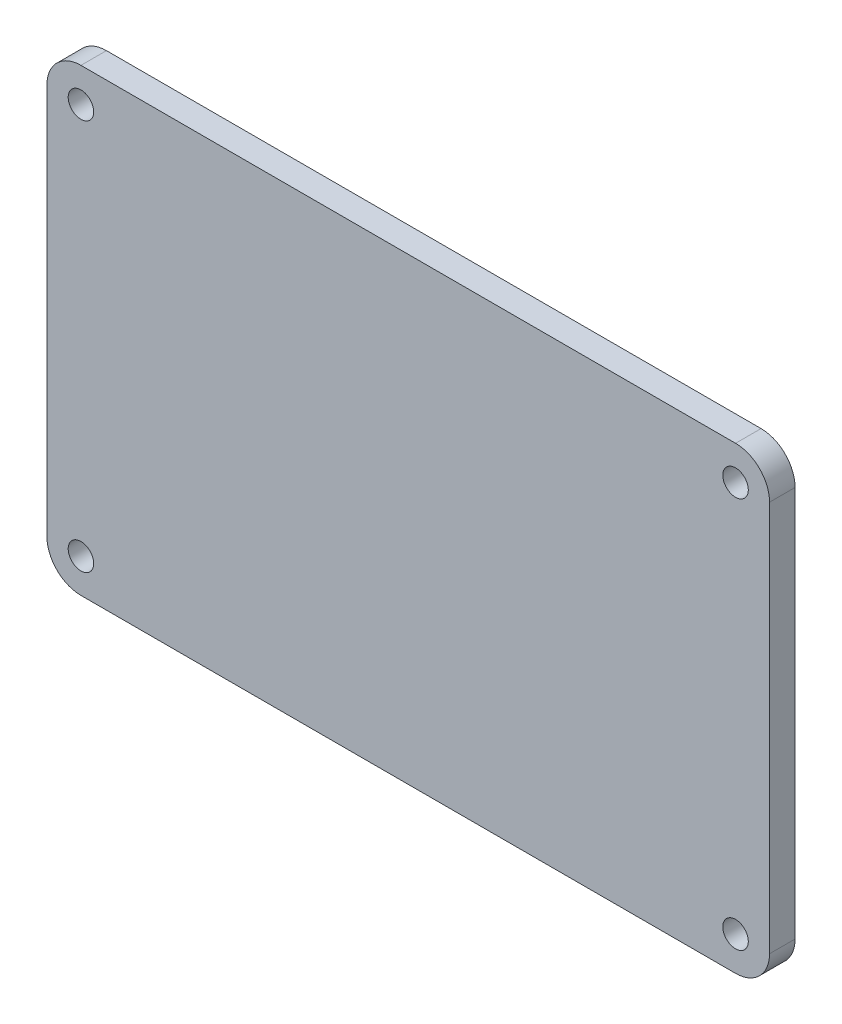
ISO-10303-21;
HEADER;
FILE_DESCRIPTION(('STEP AP214'),'2;1');
FILE_NAME('part.step','',(''),(''),'','','');
FILE_SCHEMA(('AUTOMOTIVE_DESIGN { 1 0 10303 214 1 1 1 1 }'));
ENDSEC;
DATA;
#1=APPLICATION_CONTEXT('core data for automotive mechanical design processes');
#2=APPLICATION_PROTOCOL_DEFINITION('international standard','automotive_design',2000,#1);
#3=PRODUCT_CONTEXT('',#1,'mechanical');
#4=PRODUCT('Part','Part','',(#3));
#5=PRODUCT_RELATED_PRODUCT_CATEGORY('part','',(#4));
#6=PRODUCT_DEFINITION_FORMATION('','',#4);
#7=PRODUCT_DEFINITION_CONTEXT('part definition',#1,'design');
#8=PRODUCT_DEFINITION('design','',#6,#7);
#9=PRODUCT_DEFINITION_SHAPE('','',#8);
#10=(LENGTH_UNIT() NAMED_UNIT(*) SI_UNIT(.MILLI.,.METRE.));
#11=(NAMED_UNIT(*) PLANE_ANGLE_UNIT() SI_UNIT($,.RADIAN.));
#12=(NAMED_UNIT(*) SI_UNIT($,.STERADIAN.) SOLID_ANGLE_UNIT());
#13=UNCERTAINTY_MEASURE_WITH_UNIT(LENGTH_MEASURE(1.E-05),#10,'distance_accuracy_value','');
#14=(GEOMETRIC_REPRESENTATION_CONTEXT(3) GLOBAL_UNCERTAINTY_ASSIGNED_CONTEXT((#13)) GLOBAL_UNIT_ASSIGNED_CONTEXT((#10,
#11,#12)) REPRESENTATION_CONTEXT('',''));
#15=CARTESIAN_POINT('',(0.,0.,0.));
#16=DIRECTION('',(0.,0.,1.));
#17=DIRECTION('',(1.,0.,0.));
#18=AXIS2_PLACEMENT_3D('',#15,#16,#17);
#19=CARTESIAN_POINT('',(106.789511844505,744.246017928353,-1986.57892124307));
#20=DIRECTION('',(0.,0.,1.));
#21=DIRECTION('',(1.,0.,0.));
#22=AXIS2_PLACEMENT_3D('',#19,#20,#21);
#23=PLANE('',#22);
#24=CARTESIAN_POINT('',(183.789511844505,744.246017928353,-1986.57892124307));
#25=DIRECTION('',(0.,0.,1.));
#26=DIRECTION('',(1.,0.,0.));
#27=AXIS2_PLACEMENT_3D('',#24,#25,#26);
#28=CIRCLE('',#27,1.5);
#29=CARTESIAN_POINT('',(185.289511844505,744.246017928353,-1986.57892124307));
#30=VERTEX_POINT('',#29);
#31=EDGE_CURVE('E221',#30,#30,#28,.T.);
#32=ORIENTED_EDGE('',*,*,#31,.F.);
#33=EDGE_LOOP('',(#32));
#34=FACE_BOUND('',#33,.T.);
#35=CARTESIAN_POINT('',(106.789511844505,698.246017928353,-1986.57892124307));
#36=DIRECTION('',(0.,0.,1.));
#37=DIRECTION('',(1.,0.,0.));
#38=AXIS2_PLACEMENT_3D('',#35,#36,#37);
#39=CIRCLE('',#38,1.49999999999994);
#40=CARTESIAN_POINT('',(108.289511844505,698.246017928353,-1986.57892124307));
#41=VERTEX_POINT('',#40);
#42=EDGE_CURVE('E146',#41,#41,#39,.T.);
#43=ORIENTED_EDGE('',*,*,#42,.F.);
#44=EDGE_LOOP('',(#43));
#45=FACE_BOUND('',#44,.T.);
#46=CARTESIAN_POINT('',(106.789511844505,744.246017928353,-1986.57892124307));
#47=DIRECTION('',(0.,0.,1.));
#48=DIRECTION('',(1.,0.,0.));
#49=AXIS2_PLACEMENT_3D('',#46,#47,#48);
#50=CIRCLE('',#49,4.00000000000002);
#51=CARTESIAN_POINT('',(106.789511844505,748.246017928353,-1986.57892124307));
#52=VERTEX_POINT('',#51);
#53=CARTESIAN_POINT('',(102.789511844505,744.246017928353,-1986.57892124307));
#54=VERTEX_POINT('',#53);
#55=EDGE_CURVE('E164',#52,#54,#50,.T.);
#56=ORIENTED_EDGE('',*,*,#55,.T.);
#57=DIRECTION('',(0.,-1.,0.));
#58=VECTOR('',#57,1.);
#59=CARTESIAN_POINT('',(102.789511844505,744.246017928353,-1986.57892124307));
#60=LINE('',#59,#58);
#61=CARTESIAN_POINT('',(102.789511844505,698.246017928353,-1986.57892124307));
#62=VERTEX_POINT('',#61);
#63=EDGE_CURVE('E100',#54,#62,#60,.T.);
#64=ORIENTED_EDGE('',*,*,#63,.T.);
#65=CARTESIAN_POINT('',(106.789511844505,698.246017928353,-1986.57892124307));
#66=DIRECTION('',(0.,0.,1.));
#67=DIRECTION('',(1.,0.,0.));
#68=AXIS2_PLACEMENT_3D('',#65,#66,#67);
#69=CIRCLE('',#68,4.);
#70=CARTESIAN_POINT('',(106.789511844505,694.246017928353,-1986.57892124307));
#71=VERTEX_POINT('',#70);
#72=EDGE_CURVE('E185',#62,#71,#69,.T.);
#73=ORIENTED_EDGE('',*,*,#72,.T.);
#74=DIRECTION('',(1.,0.,0.));
#75=VECTOR('',#74,1.);
#76=CARTESIAN_POINT('',(183.789511844505,694.246017928353,-1986.57892124307));
#77=LINE('',#76,#75);
#78=CARTESIAN_POINT('',(183.789511844505,694.246017928353,-1986.57892124307));
#79=VERTEX_POINT('',#78);
#80=EDGE_CURVE('E199',#71,#79,#77,.T.);
#81=ORIENTED_EDGE('',*,*,#80,.T.);
#82=CARTESIAN_POINT('',(183.789511844505,698.246017928353,-1986.57892124307));
#83=DIRECTION('',(0.,0.,1.));
#84=DIRECTION('',(1.,0.,0.));
#85=AXIS2_PLACEMENT_3D('',#82,#83,#84);
#86=CIRCLE('',#85,3.99999999999999);
#87=CARTESIAN_POINT('',(187.789511844505,698.246017928353,-1986.57892124307));
#88=VERTEX_POINT('',#87);
#89=EDGE_CURVE('E119',#79,#88,#86,.T.);
#90=ORIENTED_EDGE('',*,*,#89,.T.);
#91=DIRECTION('',(0.,1.,0.));
#92=VECTOR('',#91,1.);
#93=CARTESIAN_POINT('',(187.789511844505,744.246017928353,-1986.57892124307));
#94=LINE('',#93,#92);
#95=CARTESIAN_POINT('',(187.789511844505,744.246017928353,-1986.57892124307));
#96=VERTEX_POINT('',#95);
#97=EDGE_CURVE('E113',#88,#96,#94,.T.);
#98=ORIENTED_EDGE('',*,*,#97,.T.);
#99=CARTESIAN_POINT('',(183.789511844505,744.246017928353,-1986.57892124307));
#100=DIRECTION('',(0.,0.,1.));
#101=DIRECTION('',(-1.,0.,0.));
#102=AXIS2_PLACEMENT_3D('',#99,#100,#101);
#103=CIRCLE('',#102,3.99999999999999);
#104=CARTESIAN_POINT('',(183.789511844505,748.246017928353,-1986.57892124307));
#105=VERTEX_POINT('',#104);
#106=EDGE_CURVE('E117',#96,#105,#103,.T.);
#107=ORIENTED_EDGE('',*,*,#106,.T.);
#108=DIRECTION('',(-1.,0.,0.));
#109=VECTOR('',#108,1.);
#110=CARTESIAN_POINT('',(106.789511844505,748.246017928353,-1986.57892124307));
#111=LINE('',#110,#109);
#112=EDGE_CURVE('E57',#105,#52,#111,.T.);
#113=ORIENTED_EDGE('',*,*,#112,.T.);
#114=EDGE_LOOP('',(#56,#64,#73,#81,#90,#98,#107,#113));
#115=FACE_BOUND('',#114,.T.);
#116=CARTESIAN_POINT('',(106.789511844505,744.246017928353,-1986.57892124307));
#117=DIRECTION('',(0.,0.,1.));
#118=DIRECTION('',(1.,0.,0.));
#119=AXIS2_PLACEMENT_3D('',#116,#117,#118);
#120=CIRCLE('',#119,1.5);
#121=CARTESIAN_POINT('',(108.289511844505,744.246017928353,-1986.57892124307));
#122=VERTEX_POINT('',#121);
#123=EDGE_CURVE('E213',#122,#122,#120,.T.);
#124=ORIENTED_EDGE('',*,*,#123,.F.);
#125=EDGE_LOOP('',(#124));
#126=FACE_BOUND('',#125,.T.);
#127=CARTESIAN_POINT('',(183.789511844505,698.246017928353,-1986.57892124307));
#128=DIRECTION('',(0.,0.,1.));
#129=DIRECTION('',(1.,0.,0.));
#130=AXIS2_PLACEMENT_3D('',#127,#128,#129);
#131=CIRCLE('',#130,1.49999999999997);
#132=CARTESIAN_POINT('',(185.289511844505,698.246017928353,-1986.57892124307));
#133=VERTEX_POINT('',#132);
#134=EDGE_CURVE('E229',#133,#133,#131,.T.);
#135=ORIENTED_EDGE('',*,*,#134,.F.);
#136=EDGE_LOOP('',(#135));
#137=FACE_BOUND('',#136,.T.);
#138=ADVANCED_FACE('F39',(#34,#45,#115,#126,#137),#23,.T.);
#139=CARTESIAN_POINT('',(106.789511844505,744.246017928353,-1989.57892124307));
#140=DIRECTION('',(0.,0.,1.));
#141=DIRECTION('',(1.,0.,0.));
#142=AXIS2_PLACEMENT_3D('',#139,#140,#141);
#143=PLANE('',#142);
#144=CARTESIAN_POINT('',(106.789511844505,744.246017928353,-1989.57892124307));
#145=DIRECTION('',(0.,0.,1.));
#146=DIRECTION('',(1.,0.,0.));
#147=AXIS2_PLACEMENT_3D('',#144,#145,#146);
#148=CIRCLE('',#147,4.00000000000002);
#149=CARTESIAN_POINT('',(106.789511844505,748.246017928353,-1989.57892124307));
#150=VERTEX_POINT('',#149);
#151=CARTESIAN_POINT('',(102.789511844505,744.246017928353,-1989.57892124307));
#152=VERTEX_POINT('',#151);
#153=EDGE_CURVE('E141',#150,#152,#148,.T.);
#154=ORIENTED_EDGE('',*,*,#153,.F.);
#155=DIRECTION('',(-1.,0.,0.));
#156=VECTOR('',#155,1.);
#157=CARTESIAN_POINT('',(106.789511844505,748.246017928353,-1989.57892124307));
#158=LINE('',#157,#156);
#159=CARTESIAN_POINT('',(183.789511844505,748.246017928353,-1989.57892124307));
#160=VERTEX_POINT('',#159);
#161=EDGE_CURVE('E92',#160,#150,#158,.T.);
#162=ORIENTED_EDGE('',*,*,#161,.F.);
#163=CARTESIAN_POINT('',(183.789511844505,744.246017928353,-1989.57892124307));
#164=DIRECTION('',(0.,0.,1.));
#165=DIRECTION('',(-1.,0.,0.));
#166=AXIS2_PLACEMENT_3D('',#163,#164,#165);
#167=CIRCLE('',#166,3.99999999999999);
#168=CARTESIAN_POINT('',(187.789511844505,744.246017928353,-1989.57892124307));
#169=VERTEX_POINT('',#168);
#170=EDGE_CURVE('E86',#169,#160,#167,.T.);
#171=ORIENTED_EDGE('',*,*,#170,.F.);
#172=DIRECTION('',(0.,1.,0.));
#173=VECTOR('',#172,1.);
#174=CARTESIAN_POINT('',(187.789511844505,744.246017928353,-1989.57892124307));
#175=LINE('',#174,#173);
#176=CARTESIAN_POINT('',(187.789511844505,698.246017928353,-1989.57892124307));
#177=VERTEX_POINT('',#176);
#178=EDGE_CURVE('E128',#177,#169,#175,.T.);
#179=ORIENTED_EDGE('',*,*,#178,.F.);
#180=CARTESIAN_POINT('',(183.789511844505,698.246017928353,-1989.57892124307));
#181=DIRECTION('',(0.,0.,1.));
#182=DIRECTION('',(1.,0.,0.));
#183=AXIS2_PLACEMENT_3D('',#180,#181,#182);
#184=CIRCLE('',#183,3.99999999999999);
#185=CARTESIAN_POINT('',(183.789511844505,694.246017928353,-1989.57892124307));
#186=VERTEX_POINT('',#185);
#187=EDGE_CURVE('E155',#186,#177,#184,.T.);
#188=ORIENTED_EDGE('',*,*,#187,.F.);
#189=DIRECTION('',(1.,0.,0.));
#190=VECTOR('',#189,1.);
#191=CARTESIAN_POINT('',(183.789511844505,694.246017928353,-1989.57892124307));
#192=LINE('',#191,#190);
#193=CARTESIAN_POINT('',(106.789511844505,694.246017928353,-1989.57892124307));
#194=VERTEX_POINT('',#193);
#195=EDGE_CURVE('E152',#194,#186,#192,.T.);
#196=ORIENTED_EDGE('',*,*,#195,.F.);
#197=CARTESIAN_POINT('',(106.789511844505,698.246017928353,-1989.57892124307));
#198=DIRECTION('',(0.,0.,1.));
#199=DIRECTION('',(1.,0.,0.));
#200=AXIS2_PLACEMENT_3D('',#197,#198,#199);
#201=CIRCLE('',#200,4.);
#202=CARTESIAN_POINT('',(102.789511844505,698.246017928353,-1989.57892124307));
#203=VERTEX_POINT('',#202);
#204=EDGE_CURVE('E149',#203,#194,#201,.T.);
#205=ORIENTED_EDGE('',*,*,#204,.F.);
#206=DIRECTION('',(0.,-1.,0.));
#207=VECTOR('',#206,1.);
#208=CARTESIAN_POINT('',(102.789511844505,744.246017928353,-1989.57892124307));
#209=LINE('',#208,#207);
#210=EDGE_CURVE('E145',#152,#203,#209,.T.);
#211=ORIENTED_EDGE('',*,*,#210,.F.);
#212=EDGE_LOOP('',(#154,#162,#171,#179,#188,#196,#205,#211));
#213=FACE_BOUND('',#212,.T.);
#214=CARTESIAN_POINT('',(106.789511844505,698.246017928353,-1989.57892124307));
#215=DIRECTION('',(0.,0.,1.));
#216=DIRECTION('',(1.,0.,0.));
#217=AXIS2_PLACEMENT_3D('',#214,#215,#216);
#218=CIRCLE('',#217,1.49999999999994);
#219=CARTESIAN_POINT('',(108.289511844505,698.246017928353,-1989.57892124307));
#220=VERTEX_POINT('',#219);
#221=EDGE_CURVE('E209',#220,#220,#218,.T.);
#222=ORIENTED_EDGE('',*,*,#221,.T.);
#223=EDGE_LOOP('',(#222));
#224=FACE_BOUND('',#223,.T.);
#225=CARTESIAN_POINT('',(106.789511844505,744.246017928353,-1989.57892124307));
#226=DIRECTION('',(0.,0.,1.));
#227=DIRECTION('',(1.,0.,0.));
#228=AXIS2_PLACEMENT_3D('',#225,#226,#227);
#229=CIRCLE('',#228,1.5);
#230=CARTESIAN_POINT('',(108.289511844505,744.246017928353,-1989.57892124307));
#231=VERTEX_POINT('',#230);
#232=EDGE_CURVE('E217',#231,#231,#229,.T.);
#233=ORIENTED_EDGE('',*,*,#232,.T.);
#234=EDGE_LOOP('',(#233));
#235=FACE_BOUND('',#234,.T.);
#236=CARTESIAN_POINT('',(183.789511844505,744.246017928353,-1989.57892124307));
#237=DIRECTION('',(0.,0.,1.));
#238=DIRECTION('',(1.,0.,0.));
#239=AXIS2_PLACEMENT_3D('',#236,#237,#238);
#240=CIRCLE('',#239,1.5);
#241=CARTESIAN_POINT('',(185.289511844505,744.246017928353,-1989.57892124307));
#242=VERTEX_POINT('',#241);
#243=EDGE_CURVE('E225',#242,#242,#240,.T.);
#244=ORIENTED_EDGE('',*,*,#243,.T.);
#245=EDGE_LOOP('',(#244));
#246=FACE_BOUND('',#245,.T.);
#247=CARTESIAN_POINT('',(183.789511844505,698.246017928353,-1989.57892124307));
#248=DIRECTION('',(0.,0.,1.));
#249=DIRECTION('',(1.,0.,0.));
#250=AXIS2_PLACEMENT_3D('',#247,#248,#249);
#251=CIRCLE('',#250,1.49999999999997);
#252=CARTESIAN_POINT('',(185.289511844505,698.246017928353,-1989.57892124307));
#253=VERTEX_POINT('',#252);
#254=EDGE_CURVE('E233',#253,#253,#251,.T.);
#255=ORIENTED_EDGE('',*,*,#254,.T.);
#256=EDGE_LOOP('',(#255));
#257=FACE_BOUND('',#256,.T.);
#258=ADVANCED_FACE('F189',(#213,#224,#235,#246,#257),#143,.F.);
#259=CARTESIAN_POINT('',(106.789511844505,744.246017928353,-1986.57892124307));
#260=DIRECTION('',(0.,0.,-1.));
#261=DIRECTION('',(-1.,0.,0.));
#262=AXIS2_PLACEMENT_3D('',#259,#260,#261);
#263=CYLINDRICAL_SURFACE('',#262,4.00000000000002);
#264=ORIENTED_EDGE('',*,*,#153,.T.);
#265=DIRECTION('',(0.,0.,-1.));
#266=VECTOR('',#265,1.);
#267=CARTESIAN_POINT('',(102.789511844505,744.246017928353,-1986.57892124307));
#268=LINE('',#267,#266);
#269=EDGE_CURVE('E11',#54,#152,#268,.T.);
#270=ORIENTED_EDGE('',*,*,#269,.F.);
#271=ORIENTED_EDGE('',*,*,#55,.F.);
#272=DIRECTION('',(0.,0.,-1.));
#273=VECTOR('',#272,1.);
#274=CARTESIAN_POINT('',(106.789511844505,748.246017928353,-1986.57892124307));
#275=LINE('',#274,#273);
#276=EDGE_CURVE('E137',#52,#150,#275,.T.);
#277=ORIENTED_EDGE('',*,*,#276,.T.);
#278=EDGE_LOOP('',(#264,#270,#271,#277));
#279=FACE_BOUND('',#278,.T.);
#280=ADVANCED_FACE('F41',(#279),#263,.T.);
#281=CARTESIAN_POINT('',(102.789511844505,744.246017928353,-1986.57892124307));
#282=DIRECTION('',(1.,0.,0.));
#283=DIRECTION('',(0.,0.,-1.));
#284=AXIS2_PLACEMENT_3D('',#281,#282,#283);
#285=PLANE('',#284);
#286=ORIENTED_EDGE('',*,*,#210,.T.);
#287=DIRECTION('',(0.,0.,-1.));
#288=VECTOR('',#287,1.);
#289=CARTESIAN_POINT('',(102.789511844505,698.246017928353,-1986.57892124307));
#290=LINE('',#289,#288);
#291=EDGE_CURVE('E49',#62,#203,#290,.T.);
#292=ORIENTED_EDGE('',*,*,#291,.F.);
#293=ORIENTED_EDGE('',*,*,#63,.F.);
#294=ORIENTED_EDGE('',*,*,#269,.T.);
#295=EDGE_LOOP('',(#286,#292,#293,#294));
#296=FACE_BOUND('',#295,.T.);
#297=ADVANCED_FACE('F269',(#296),#285,.F.);
#298=CARTESIAN_POINT('',(106.789511844505,698.246017928353,-1986.57892124307));
#299=DIRECTION('',(0.,0.,-1.));
#300=DIRECTION('',(-1.,0.,0.));
#301=AXIS2_PLACEMENT_3D('',#298,#299,#300);
#302=CYLINDRICAL_SURFACE('',#301,4.);
#303=ORIENTED_EDGE('',*,*,#204,.T.);
#304=DIRECTION('',(0.,0.,-1.));
#305=VECTOR('',#304,1.);
#306=CARTESIAN_POINT('',(106.789511844505,694.246017928353,-1986.57892124307));
#307=LINE('',#306,#305);
#308=EDGE_CURVE('E175',#71,#194,#307,.T.);
#309=ORIENTED_EDGE('',*,*,#308,.F.);
#310=ORIENTED_EDGE('',*,*,#72,.F.);
#311=ORIENTED_EDGE('',*,*,#291,.T.);
#312=EDGE_LOOP('',(#303,#309,#310,#311));
#313=FACE_BOUND('',#312,.T.);
#314=ADVANCED_FACE('F183',(#313),#302,.T.);
#315=CARTESIAN_POINT('',(183.789511844505,694.246017928353,-1986.57892124307));
#316=DIRECTION('',(0.,1.,0.));
#317=DIRECTION('',(0.,0.,1.));
#318=AXIS2_PLACEMENT_3D('',#315,#316,#317);
#319=PLANE('',#318);
#320=ORIENTED_EDGE('',*,*,#195,.T.);
#321=DIRECTION('',(0.,0.,-1.));
#322=VECTOR('',#321,1.);
#323=CARTESIAN_POINT('',(183.789511844505,694.246017928353,-1986.57892124307));
#324=LINE('',#323,#322);
#325=EDGE_CURVE('E171',#79,#186,#324,.T.);
#326=ORIENTED_EDGE('',*,*,#325,.F.);
#327=ORIENTED_EDGE('',*,*,#80,.F.);
#328=ORIENTED_EDGE('',*,*,#308,.T.);
#329=EDGE_LOOP('',(#320,#326,#327,#328));
#330=FACE_BOUND('',#329,.T.);
#331=ADVANCED_FACE('F194',(#330),#319,.F.);
#332=CARTESIAN_POINT('',(183.789511844505,698.246017928353,-1986.57892124307));
#333=DIRECTION('',(0.,0.,-1.));
#334=DIRECTION('',(-1.,0.,0.));
#335=AXIS2_PLACEMENT_3D('',#332,#333,#334);
#336=CYLINDRICAL_SURFACE('',#335,3.99999999999999);
#337=ORIENTED_EDGE('',*,*,#187,.T.);
#338=DIRECTION('',(0.,0.,-1.));
#339=VECTOR('',#338,1.);
#340=CARTESIAN_POINT('',(187.789511844505,698.246017928353,-1986.57892124307));
#341=LINE('',#340,#339);
#342=EDGE_CURVE('E130',#88,#177,#341,.T.);
#343=ORIENTED_EDGE('',*,*,#342,.F.);
#344=ORIENTED_EDGE('',*,*,#89,.F.);
#345=ORIENTED_EDGE('',*,*,#325,.T.);
#346=EDGE_LOOP('',(#337,#343,#344,#345));
#347=FACE_BOUND('',#346,.T.);
#348=ADVANCED_FACE('F197',(#347),#336,.T.);
#349=CARTESIAN_POINT('',(187.789511844505,744.246017928353,-1986.57892124307));
#350=DIRECTION('',(-1.,0.,0.));
#351=DIRECTION('',(0.,0.,1.));
#352=AXIS2_PLACEMENT_3D('',#349,#350,#351);
#353=PLANE('',#352);
#354=ORIENTED_EDGE('',*,*,#178,.T.);
#355=DIRECTION('',(0.,0.,-1.));
#356=VECTOR('',#355,1.);
#357=CARTESIAN_POINT('',(187.789511844505,744.246017928353,-1986.57892124307));
#358=LINE('',#357,#356);
#359=EDGE_CURVE('E125',#96,#169,#358,.T.);
#360=ORIENTED_EDGE('',*,*,#359,.F.);
#361=ORIENTED_EDGE('',*,*,#97,.F.);
#362=ORIENTED_EDGE('',*,*,#342,.T.);
#363=EDGE_LOOP('',(#354,#360,#361,#362));
#364=FACE_BOUND('',#363,.T.);
#365=ADVANCED_FACE('F126',(#364),#353,.F.);
#366=CARTESIAN_POINT('',(183.789511844505,744.246017928353,-1986.57892124307));
#367=DIRECTION('',(0.,0.,-1.));
#368=DIRECTION('',(-1.,0.,0.));
#369=AXIS2_PLACEMENT_3D('',#366,#367,#368);
#370=CYLINDRICAL_SURFACE('',#369,3.99999999999999);
#371=ORIENTED_EDGE('',*,*,#170,.T.);
#372=DIRECTION('',(0.,0.,-1.));
#373=VECTOR('',#372,1.);
#374=CARTESIAN_POINT('',(183.789511844505,748.246017928353,-1986.57892124307));
#375=LINE('',#374,#373);
#376=EDGE_CURVE('E131',#105,#160,#375,.T.);
#377=ORIENTED_EDGE('',*,*,#376,.F.);
#378=ORIENTED_EDGE('',*,*,#106,.F.);
#379=ORIENTED_EDGE('',*,*,#359,.T.);
#380=EDGE_LOOP('',(#371,#377,#378,#379));
#381=FACE_BOUND('',#380,.T.);
#382=ADVANCED_FACE('F133',(#381),#370,.T.);
#383=CARTESIAN_POINT('',(106.789511844505,748.246017928353,-1986.57892124307));
#384=DIRECTION('',(0.,-1.,0.));
#385=DIRECTION('',(0.,0.,-1.));
#386=AXIS2_PLACEMENT_3D('',#383,#384,#385);
#387=PLANE('',#386);
#388=ORIENTED_EDGE('',*,*,#161,.T.);
#389=ORIENTED_EDGE('',*,*,#276,.F.);
#390=ORIENTED_EDGE('',*,*,#112,.F.);
#391=ORIENTED_EDGE('',*,*,#376,.T.);
#392=EDGE_LOOP('',(#388,#389,#390,#391));
#393=FACE_BOUND('',#392,.T.);
#394=ADVANCED_FACE('F257',(#393),#387,.F.);
#395=CARTESIAN_POINT('',(106.789511844505,698.246017928353,-1986.57892124307));
#396=DIRECTION('',(0.,0.,-1.));
#397=DIRECTION('',(-1.,0.,0.));
#398=AXIS2_PLACEMENT_3D('',#395,#396,#397);
#399=CYLINDRICAL_SURFACE('',#398,1.49999999999994);
#400=ORIENTED_EDGE('',*,*,#42,.T.);
#401=EDGE_LOOP('',(#400));
#402=FACE_BOUND('',#401,.T.);
#403=ORIENTED_EDGE('',*,*,#221,.F.);
#404=EDGE_LOOP('',(#403));
#405=FACE_BOUND('',#404,.T.);
#406=ADVANCED_FACE('F254',(#402,#405),#399,.F.);
#407=CARTESIAN_POINT('',(106.789511844505,744.246017928353,-1986.57892124307));
#408=DIRECTION('',(0.,0.,-1.));
#409=DIRECTION('',(-1.,0.,0.));
#410=AXIS2_PLACEMENT_3D('',#407,#408,#409);
#411=CYLINDRICAL_SURFACE('',#410,1.5);
#412=ORIENTED_EDGE('',*,*,#123,.T.);
#413=EDGE_LOOP('',(#412));
#414=FACE_BOUND('',#413,.T.);
#415=ORIENTED_EDGE('',*,*,#232,.F.);
#416=EDGE_LOOP('',(#415));
#417=FACE_BOUND('',#416,.T.);
#418=ADVANCED_FACE('F333',(#414,#417),#411,.F.);
#419=CARTESIAN_POINT('',(183.789511844505,744.246017928353,-1986.57892124307));
#420=DIRECTION('',(0.,0.,-1.));
#421=DIRECTION('',(-1.,0.,0.));
#422=AXIS2_PLACEMENT_3D('',#419,#420,#421);
#423=CYLINDRICAL_SURFACE('',#422,1.5);
#424=ORIENTED_EDGE('',*,*,#31,.T.);
#425=EDGE_LOOP('',(#424));
#426=FACE_BOUND('',#425,.T.);
#427=ORIENTED_EDGE('',*,*,#243,.F.);
#428=EDGE_LOOP('',(#427));
#429=FACE_BOUND('',#428,.T.);
#430=ADVANCED_FACE('F341',(#426,#429),#423,.F.);
#431=CARTESIAN_POINT('',(183.789511844505,698.246017928353,-1986.57892124307));
#432=DIRECTION('',(0.,0.,-1.));
#433=DIRECTION('',(-1.,0.,0.));
#434=AXIS2_PLACEMENT_3D('',#431,#432,#433);
#435=CYLINDRICAL_SURFACE('',#434,1.49999999999997);
#436=ORIENTED_EDGE('',*,*,#134,.T.);
#437=EDGE_LOOP('',(#436));
#438=FACE_BOUND('',#437,.T.);
#439=ORIENTED_EDGE('',*,*,#254,.F.);
#440=EDGE_LOOP('',(#439));
#441=FACE_BOUND('',#440,.T.);
#442=ADVANCED_FACE('F241',(#438,#441),#435,.F.);
#443=CLOSED_SHELL('',(#138,#258,#280,#297,#314,#331,#348,#365,#382,#394,#406,#418,#430,#442));
#444=MANIFOLD_SOLID_BREP('B2',#443);
#445=ADVANCED_BREP_SHAPE_REPRESENTATION('',(#18,#444),#14);
#446=SHAPE_DEFINITION_REPRESENTATION(#9,#445);
ENDSEC;
END-ISO-10303-21;
